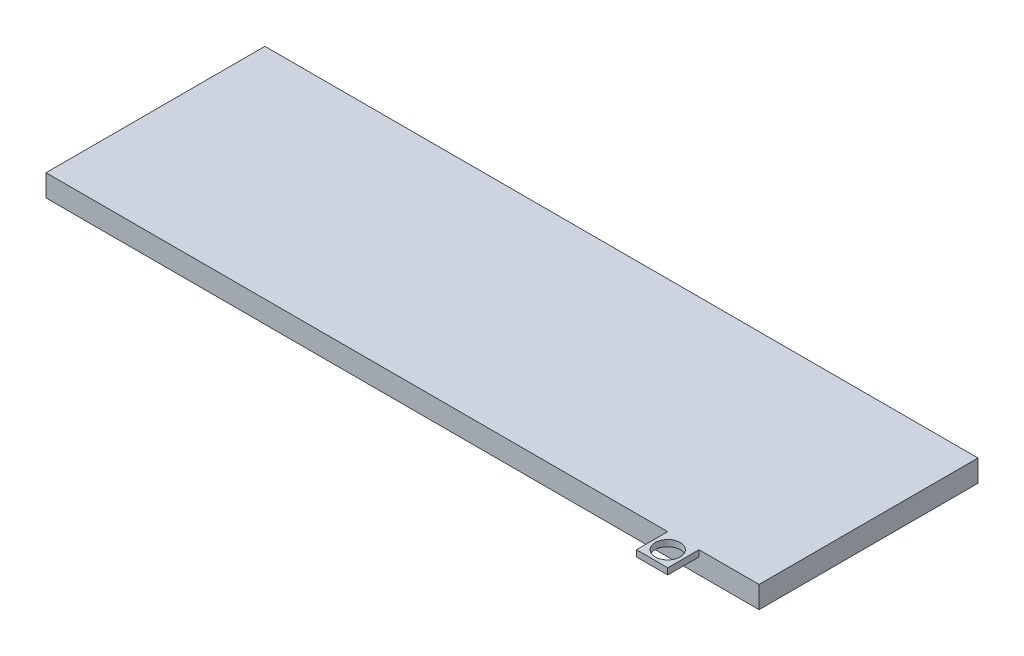
ISO-10303-21;
HEADER;
FILE_DESCRIPTION(('STEP AP214'),'2;1');
FILE_NAME('part.step','',(''),(''),'','','');
FILE_SCHEMA(('AUTOMOTIVE_DESIGN { 1 0 10303 214 1 1 1 1 }'));
ENDSEC;
DATA;
#1=APPLICATION_CONTEXT('core data for automotive mechanical design processes');
#2=APPLICATION_PROTOCOL_DEFINITION('international standard','automotive_design',2000,#1);
#3=PRODUCT_CONTEXT('',#1,'mechanical');
#4=PRODUCT('Part','Part','',(#3));
#5=PRODUCT_RELATED_PRODUCT_CATEGORY('part','',(#4));
#6=PRODUCT_DEFINITION_FORMATION('','',#4);
#7=PRODUCT_DEFINITION_CONTEXT('part definition',#1,'design');
#8=PRODUCT_DEFINITION('design','',#6,#7);
#9=PRODUCT_DEFINITION_SHAPE('','',#8);
#10=(LENGTH_UNIT() NAMED_UNIT(*) SI_UNIT(.MILLI.,.METRE.));
#11=(NAMED_UNIT(*) PLANE_ANGLE_UNIT() SI_UNIT($,.RADIAN.));
#12=(NAMED_UNIT(*) SI_UNIT($,.STERADIAN.) SOLID_ANGLE_UNIT());
#13=UNCERTAINTY_MEASURE_WITH_UNIT(LENGTH_MEASURE(1.E-05),#10,'distance_accuracy_value','');
#14=(GEOMETRIC_REPRESENTATION_CONTEXT(3) GLOBAL_UNCERTAINTY_ASSIGNED_CONTEXT((#13)) GLOBAL_UNIT_ASSIGNED_CONTEXT((#10,
#11,#12)) REPRESENTATION_CONTEXT('',''));
#15=CARTESIAN_POINT('',(0.,0.,0.));
#16=DIRECTION('',(0.,0.,1.));
#17=DIRECTION('',(1.,0.,0.));
#18=AXIS2_PLACEMENT_3D('',#15,#16,#17);
#19=CARTESIAN_POINT('',(110.927364864865,1.1264705882353,70.));
#20=DIRECTION('',(0.,1.,0.));
#21=DIRECTION('',(0.,0.,1.));
#22=AXIS2_PLACEMENT_3D('',#19,#20,#21);
#23=PLANE('',#22);
#24=CARTESIAN_POINT('',(88.7182207620565,1.1264705882353,75.));
#25=DIRECTION('',(0.,-1.,0.));
#26=DIRECTION('',(0.,0.,-1.));
#27=AXIS2_PLACEMENT_3D('',#24,#25,#26);
#28=CIRCLE('',#27,4.00000000000001);
#29=CARTESIAN_POINT('',(88.7182207620565,1.1264705882353,71.));
#30=VERTEX_POINT('',#29);
#31=EDGE_CURVE('E249',#30,#30,#28,.T.);
#32=ORIENTED_EDGE('',*,*,#31,.F.);
#33=EDGE_LOOP('',(#32));
#34=FACE_BOUND('',#33,.T.);
#35=DIRECTION('',(-1.,0.,0.));
#36=VECTOR('',#35,1.);
#37=CARTESIAN_POINT('',(-113.072635135135,1.1264705882353,70.));
#38=LINE('',#37,#36);
#39=CARTESIAN_POINT('',(93.7182207620565,1.1264705882353,70.));
#40=VERTEX_POINT('',#39);
#41=CARTESIAN_POINT('',(83.7182207620565,1.1264705882353,70.));
#42=VERTEX_POINT('',#41);
#43=EDGE_CURVE('E143',#40,#42,#38,.T.);
#44=ORIENTED_EDGE('',*,*,#43,.F.);
#45=DIRECTION('',(0.,0.,1.));
#46=VECTOR('',#45,1.);
#47=CARTESIAN_POINT('',(93.7182207620565,1.1264705882353,70.));
#48=LINE('',#47,#46);
#49=CARTESIAN_POINT('',(93.7182207620565,1.1264705882353,80.));
#50=VERTEX_POINT('',#49);
#51=EDGE_CURVE('E231',#40,#50,#48,.T.);
#52=ORIENTED_EDGE('',*,*,#51,.T.);
#53=DIRECTION('',(-1.,0.,0.));
#54=VECTOR('',#53,1.);
#55=CARTESIAN_POINT('',(83.7182207620565,1.1264705882353,80.));
#56=LINE('',#55,#54);
#57=CARTESIAN_POINT('',(83.7182207620565,1.1264705882353,80.));
#58=VERTEX_POINT('',#57);
#59=EDGE_CURVE('E226',#50,#58,#56,.T.);
#60=ORIENTED_EDGE('',*,*,#59,.T.);
#61=DIRECTION('',(0.,0.,-1.));
#62=VECTOR('',#61,1.);
#63=CARTESIAN_POINT('',(83.7182207620565,1.1264705882353,70.));
#64=LINE('',#63,#62);
#65=EDGE_CURVE('E235',#58,#42,#64,.T.);
#66=ORIENTED_EDGE('',*,*,#65,.T.);
#67=EDGE_LOOP('',(#44,#52,#60,#66));
#68=FACE_BOUND('',#67,.T.);
#69=ADVANCED_FACE('F40',(#34,#68),#23,.F.);
#70=CARTESIAN_POINT('',(-113.072635135135,1.1264705882353,70.));
#71=DIRECTION('',(-1.,0.,0.));
#72=DIRECTION('',(0.,0.,1.));
#73=AXIS2_PLACEMENT_3D('',#70,#71,#72);
#74=PLANE('',#73);
#75=DIRECTION('',(0.,0.,-1.));
#76=VECTOR('',#75,1.);
#77=CARTESIAN_POINT('',(-113.072635135135,1.1264705882353,70.));
#78=LINE('',#77,#76);
#79=CARTESIAN_POINT('',(-113.072635135135,1.1264705882353,68.));
#80=VERTEX_POINT('',#79);
#81=CARTESIAN_POINT('',(-113.072635135135,1.1264705882353,2.));
#82=VERTEX_POINT('',#81);
#83=EDGE_CURVE('E64',#80,#82,#78,.T.);
#84=ORIENTED_EDGE('',*,*,#83,.F.);
#85=DIRECTION('',(0.,-1.,0.));
#86=VECTOR('',#85,1.);
#87=CARTESIAN_POINT('',(-113.072635135135,-3.8735294117647,68.));
#88=LINE('',#87,#86);
#89=CARTESIAN_POINT('',(-113.072635135135,-3.8735294117647,68.));
#90=VERTEX_POINT('',#89);
#91=EDGE_CURVE('E134',#80,#90,#88,.T.);
#92=ORIENTED_EDGE('',*,*,#91,.T.);
#93=DIRECTION('',(0.,0.,-1.));
#94=VECTOR('',#93,1.);
#95=CARTESIAN_POINT('',(-113.072635135135,-3.8735294117647,70.));
#96=LINE('',#95,#94);
#97=CARTESIAN_POINT('',(-113.072635135135,-3.8735294117647,2.));
#98=VERTEX_POINT('',#97);
#99=EDGE_CURVE('E56',#90,#98,#96,.T.);
#100=ORIENTED_EDGE('',*,*,#99,.T.);
#101=DIRECTION('',(0.,1.,0.));
#102=VECTOR('',#101,1.);
#103=CARTESIAN_POINT('',(-113.072635135135,-3.8735294117647,2.));
#104=LINE('',#103,#102);
#105=EDGE_CURVE('E206',#98,#82,#104,.T.);
#106=ORIENTED_EDGE('',*,*,#105,.T.);
#107=EDGE_LOOP('',(#84,#92,#100,#106));
#108=FACE_BOUND('',#107,.T.);
#109=ADVANCED_FACE('F141',(#108),#74,.F.);
#110=DIRECTION('',(0.,0.,-1.));
#111=VECTOR('',#110,1.);
#112=CARTESIAN_POINT('',(110.927364864865,1.1264705882353,70.));
#113=LINE('',#112,#111);
#114=CARTESIAN_POINT('',(110.927364864865,1.1264705882353,68.));
#115=VERTEX_POINT('',#114);
#116=CARTESIAN_POINT('',(110.927364864865,1.1264705882353,2.));
#117=VERTEX_POINT('',#116);
#118=EDGE_CURVE('E155',#115,#117,#113,.T.);
#119=ORIENTED_EDGE('',*,*,#118,.F.);
#120=DIRECTION('',(-1.,0.,0.));
#121=VECTOR('',#120,1.);
#122=CARTESIAN_POINT('',(-113.072635135135,1.1264705882353,68.));
#123=LINE('',#122,#121);
#124=EDGE_CURVE('E253',#115,#80,#123,.T.);
#125=ORIENTED_EDGE('',*,*,#124,.T.);
#126=ORIENTED_EDGE('',*,*,#83,.T.);
#127=DIRECTION('',(1.,0.,0.));
#128=VECTOR('',#127,1.);
#129=CARTESIAN_POINT('',(-113.072635135135,1.1264705882353,2.));
#130=LINE('',#129,#128);
#131=EDGE_CURVE('E203',#82,#117,#130,.T.);
#132=ORIENTED_EDGE('',*,*,#131,.T.);
#133=EDGE_LOOP('',(#119,#125,#126,#132));
#134=FACE_BOUND('',#133,.T.);
#135=ADVANCED_FACE('F265',(#134),#23,.F.);
#136=CARTESIAN_POINT('',(110.927364864865,1.1264705882353,70.));
#137=DIRECTION('',(1.,0.,0.));
#138=DIRECTION('',(0.,0.,-1.));
#139=AXIS2_PLACEMENT_3D('',#136,#137,#138);
#140=PLANE('',#139);
#141=DIRECTION('',(0.,0.,-1.));
#142=VECTOR('',#141,1.);
#143=CARTESIAN_POINT('',(110.927364864865,-3.87352941176471,70.));
#144=LINE('',#143,#142);
#145=CARTESIAN_POINT('',(110.927364864865,-3.87352941176471,68.));
#146=VERTEX_POINT('',#145);
#147=CARTESIAN_POINT('',(110.927364864865,-3.87352941176471,2.));
#148=VERTEX_POINT('',#147);
#149=EDGE_CURVE('E160',#146,#148,#144,.T.);
#150=ORIENTED_EDGE('',*,*,#149,.F.);
#151=DIRECTION('',(0.,1.,0.));
#152=VECTOR('',#151,1.);
#153=CARTESIAN_POINT('',(110.927364864865,1.1264705882353,68.));
#154=LINE('',#153,#152);
#155=EDGE_CURVE('E136',#146,#115,#154,.T.);
#156=ORIENTED_EDGE('',*,*,#155,.T.);
#157=ORIENTED_EDGE('',*,*,#118,.T.);
#158=DIRECTION('',(0.,-1.,0.));
#159=VECTOR('',#158,1.);
#160=CARTESIAN_POINT('',(110.927364864865,1.1264705882353,2.));
#161=LINE('',#160,#159);
#162=EDGE_CURVE('E187',#117,#148,#161,.T.);
#163=ORIENTED_EDGE('',*,*,#162,.T.);
#164=EDGE_LOOP('',(#150,#156,#157,#163));
#165=FACE_BOUND('',#164,.T.);
#166=ADVANCED_FACE('F264',(#165),#140,.F.);
#167=CARTESIAN_POINT('',(112.927364864865,3.12647058823529,70.));
#168=DIRECTION('',(0.,-1.,0.));
#169=DIRECTION('',(1.,0.,0.));
#170=AXIS2_PLACEMENT_3D('',#167,#168,#169);
#171=PLANE('',#170);
#172=DIRECTION('',(-1.,0.,0.));
#173=VECTOR('',#172,1.);
#174=CARTESIAN_POINT('',(112.927364864865,3.12647058823529,0.));
#175=LINE('',#174,#173);
#176=CARTESIAN_POINT('',(112.927364864865,3.12647058823529,0.));
#177=VERTEX_POINT('',#176);
#178=CARTESIAN_POINT('',(-115.072635135135,3.1264705882353,0.));
#179=VERTEX_POINT('',#178);
#180=EDGE_CURVE('E183',#177,#179,#175,.T.);
#181=ORIENTED_EDGE('',*,*,#180,.T.);
#182=DIRECTION('',(0.,0.,-1.));
#183=VECTOR('',#182,1.);
#184=CARTESIAN_POINT('',(-115.072635135135,3.1264705882353,70.));
#185=LINE('',#184,#183);
#186=CARTESIAN_POINT('',(-115.072635135135,3.1264705882353,70.));
#187=VERTEX_POINT('',#186);
#188=EDGE_CURVE('E11',#187,#179,#185,.T.);
#189=ORIENTED_EDGE('',*,*,#188,.F.);
#190=DIRECTION('',(-1.,0.,0.));
#191=VECTOR('',#190,1.);
#192=CARTESIAN_POINT('',(112.927364864865,3.12647058823529,70.));
#193=LINE('',#192,#191);
#194=CARTESIAN_POINT('',(83.7182207620565,3.1264705882353,70.));
#195=VERTEX_POINT('',#194);
#196=EDGE_CURVE('E175',#195,#187,#193,.T.);
#197=ORIENTED_EDGE('',*,*,#196,.F.);
#198=DIRECTION('',(0.,0.,-1.));
#199=VECTOR('',#198,1.);
#200=CARTESIAN_POINT('',(83.7182207620565,3.1264705882353,70.));
#201=LINE('',#200,#199);
#202=CARTESIAN_POINT('',(83.7182207620565,3.1264705882353,80.));
#203=VERTEX_POINT('',#202);
#204=EDGE_CURVE('E230',#203,#195,#201,.T.);
#205=ORIENTED_EDGE('',*,*,#204,.F.);
#206=DIRECTION('',(-1.,0.,0.));
#207=VECTOR('',#206,1.);
#208=CARTESIAN_POINT('',(83.7182207620565,3.1264705882353,80.));
#209=LINE('',#208,#207);
#210=CARTESIAN_POINT('',(93.7182207620565,3.1264705882353,80.));
#211=VERTEX_POINT('',#210);
#212=EDGE_CURVE('E217',#211,#203,#209,.T.);
#213=ORIENTED_EDGE('',*,*,#212,.F.);
#214=DIRECTION('',(0.,0.,1.));
#215=VECTOR('',#214,1.);
#216=CARTESIAN_POINT('',(93.7182207620565,3.1264705882353,70.));
#217=LINE('',#216,#215);
#218=CARTESIAN_POINT('',(93.7182207620565,3.1264705882353,70.));
#219=VERTEX_POINT('',#218);
#220=EDGE_CURVE('E243',#219,#211,#217,.T.);
#221=ORIENTED_EDGE('',*,*,#220,.F.);
#222=CARTESIAN_POINT('',(112.927364864865,3.12647058823529,70.));
#223=VERTEX_POINT('',#222);
#224=EDGE_CURVE('E196',#223,#219,#193,.T.);
#225=ORIENTED_EDGE('',*,*,#224,.F.);
#226=DIRECTION('',(0.,0.,-1.));
#227=VECTOR('',#226,1.);
#228=CARTESIAN_POINT('',(112.927364864865,3.12647058823529,70.));
#229=LINE('',#228,#227);
#230=EDGE_CURVE('E167',#223,#177,#229,.T.);
#231=ORIENTED_EDGE('',*,*,#230,.T.);
#232=EDGE_LOOP('',(#181,#189,#197,#205,#213,#221,#225,#231));
#233=FACE_BOUND('',#232,.T.);
#234=CARTESIAN_POINT('',(88.7182207620565,3.1264705882353,75.));
#235=DIRECTION('',(0.,-1.,0.));
#236=DIRECTION('',(0.,0.,-1.));
#237=AXIS2_PLACEMENT_3D('',#234,#235,#236);
#238=CIRCLE('',#237,4.00000000000001);
#239=CARTESIAN_POINT('',(88.7182207620565,3.1264705882353,71.));
#240=VERTEX_POINT('',#239);
#241=EDGE_CURVE('E239',#240,#240,#238,.T.);
#242=ORIENTED_EDGE('',*,*,#241,.T.);
#243=EDGE_LOOP('',(#242));
#244=FACE_BOUND('',#243,.T.);
#245=ADVANCED_FACE('F42',(#233,#244),#171,.F.);
#246=CARTESIAN_POINT('',(-115.072635135135,3.1264705882353,70.));
#247=DIRECTION('',(1.,0.,0.));
#248=DIRECTION('',(0.,0.,-1.));
#249=AXIS2_PLACEMENT_3D('',#246,#247,#248);
#250=PLANE('',#249);
#251=DIRECTION('',(0.,-1.,0.));
#252=VECTOR('',#251,1.);
#253=CARTESIAN_POINT('',(-115.072635135135,3.1264705882353,0.));
#254=LINE('',#253,#252);
#255=CARTESIAN_POINT('',(-115.072635135135,-3.8735294117647,0.));
#256=VERTEX_POINT('',#255);
#257=EDGE_CURVE('E179',#179,#256,#254,.T.);
#258=ORIENTED_EDGE('',*,*,#257,.T.);
#259=DIRECTION('',(0.,0.,-1.));
#260=VECTOR('',#259,1.);
#261=CARTESIAN_POINT('',(-115.072635135135,-3.8735294117647,70.));
#262=LINE('',#261,#260);
#263=CARTESIAN_POINT('',(-115.072635135135,-3.8735294117647,70.));
#264=VERTEX_POINT('',#263);
#265=EDGE_CURVE('E49',#264,#256,#262,.T.);
#266=ORIENTED_EDGE('',*,*,#265,.F.);
#267=DIRECTION('',(0.,-1.,0.));
#268=VECTOR('',#267,1.);
#269=CARTESIAN_POINT('',(-115.072635135135,3.1264705882353,70.));
#270=LINE('',#269,#268);
#271=EDGE_CURVE('E193',#187,#264,#270,.T.);
#272=ORIENTED_EDGE('',*,*,#271,.F.);
#273=ORIENTED_EDGE('',*,*,#188,.T.);
#274=EDGE_LOOP('',(#258,#266,#272,#273));
#275=FACE_BOUND('',#274,.T.);
#276=ADVANCED_FACE('F302',(#275),#250,.F.);
#277=CARTESIAN_POINT('',(110.927364864865,-3.87352941176471,70.));
#278=DIRECTION('',(0.,1.,0.));
#279=DIRECTION('',(0.,0.,1.));
#280=AXIS2_PLACEMENT_3D('',#277,#278,#279);
#281=PLANE('',#280);
#282=ORIENTED_EDGE('',*,*,#99,.F.);
#283=DIRECTION('',(1.,0.,0.));
#284=VECTOR('',#283,1.);
#285=CARTESIAN_POINT('',(-113.072635135135,-3.8735294117647,68.));
#286=LINE('',#285,#284);
#287=EDGE_CURVE('E132',#90,#146,#286,.T.);
#288=ORIENTED_EDGE('',*,*,#287,.T.);
#289=ORIENTED_EDGE('',*,*,#149,.T.);
#290=DIRECTION('',(-1.,0.,0.));
#291=VECTOR('',#290,1.);
#292=CARTESIAN_POINT('',(110.927364864865,-3.87352941176471,2.));
#293=LINE('',#292,#291);
#294=EDGE_CURVE('E149',#148,#98,#293,.T.);
#295=ORIENTED_EDGE('',*,*,#294,.T.);
#296=EDGE_LOOP('',(#282,#288,#289,#295));
#297=FACE_BOUND('',#296,.T.);
#298=DIRECTION('',(1.,0.,0.));
#299=VECTOR('',#298,1.);
#300=CARTESIAN_POINT('',(110.927364864865,-3.87352941176471,0.));
#301=LINE('',#300,#299);
#302=CARTESIAN_POINT('',(112.927364864865,-3.87352941176471,0.));
#303=VERTEX_POINT('',#302);
#304=EDGE_CURVE('E176',#256,#303,#301,.T.);
#305=ORIENTED_EDGE('',*,*,#304,.T.);
#306=DIRECTION('',(0.,0.,-1.));
#307=VECTOR('',#306,1.);
#308=CARTESIAN_POINT('',(112.927364864865,-3.87352941176471,70.));
#309=LINE('',#308,#307);
#310=CARTESIAN_POINT('',(112.927364864865,-3.87352941176471,70.));
#311=VERTEX_POINT('',#310);
#312=EDGE_CURVE('E163',#311,#303,#309,.T.);
#313=ORIENTED_EDGE('',*,*,#312,.F.);
#314=DIRECTION('',(1.,0.,0.));
#315=VECTOR('',#314,1.);
#316=CARTESIAN_POINT('',(-115.072635135135,-3.8735294117647,70.));
#317=LINE('',#316,#315);
#318=EDGE_CURVE('E190',#264,#311,#317,.T.);
#319=ORIENTED_EDGE('',*,*,#318,.F.);
#320=ORIENTED_EDGE('',*,*,#265,.T.);
#321=EDGE_LOOP('',(#305,#313,#319,#320));
#322=FACE_BOUND('',#321,.T.);
#323=ADVANCED_FACE('F146',(#297,#322),#281,.F.);
#324=CARTESIAN_POINT('',(112.927364864865,3.12647058823529,70.));
#325=DIRECTION('',(-1.,0.,0.));
#326=DIRECTION('',(0.,0.,1.));
#327=AXIS2_PLACEMENT_3D('',#324,#325,#326);
#328=PLANE('',#327);
#329=DIRECTION('',(0.,1.,0.));
#330=VECTOR('',#329,1.);
#331=CARTESIAN_POINT('',(112.927364864865,3.12647058823529,0.));
#332=LINE('',#331,#330);
#333=EDGE_CURVE('E172',#303,#177,#332,.T.);
#334=ORIENTED_EDGE('',*,*,#333,.T.);
#335=ORIENTED_EDGE('',*,*,#230,.F.);
#336=DIRECTION('',(0.,1.,0.));
#337=VECTOR('',#336,1.);
#338=CARTESIAN_POINT('',(112.927364864865,3.12647058823529,70.));
#339=LINE('',#338,#337);
#340=EDGE_CURVE('E171',#311,#223,#339,.T.);
#341=ORIENTED_EDGE('',*,*,#340,.F.);
#342=ORIENTED_EDGE('',*,*,#312,.T.);
#343=EDGE_LOOP('',(#334,#335,#341,#342));
#344=FACE_BOUND('',#343,.T.);
#345=ADVANCED_FACE('F307',(#344),#328,.F.);
#346=CARTESIAN_POINT('',(0.,0.,70.));
#347=DIRECTION('',(0.,0.,1.));
#348=DIRECTION('',(1.,0.,0.));
#349=AXIS2_PLACEMENT_3D('',#346,#347,#348);
#350=PLANE('',#349);
#351=DIRECTION('',(0.,-1.,0.));
#352=VECTOR('',#351,1.);
#353=CARTESIAN_POINT('',(83.7182207620565,3.1264705882353,70.));
#354=LINE('',#353,#352);
#355=EDGE_CURVE('E212',#195,#42,#354,.T.);
#356=ORIENTED_EDGE('',*,*,#355,.F.);
#357=ORIENTED_EDGE('',*,*,#196,.T.);
#358=ORIENTED_EDGE('',*,*,#271,.T.);
#359=ORIENTED_EDGE('',*,*,#318,.T.);
#360=ORIENTED_EDGE('',*,*,#340,.T.);
#361=ORIENTED_EDGE('',*,*,#224,.T.);
#362=DIRECTION('',(0.,-1.,0.));
#363=VECTOR('',#362,1.);
#364=CARTESIAN_POINT('',(93.7182207620565,3.1264705882353,70.));
#365=LINE('',#364,#363);
#366=EDGE_CURVE('E216',#219,#40,#365,.T.);
#367=ORIENTED_EDGE('',*,*,#366,.T.);
#368=ORIENTED_EDGE('',*,*,#43,.T.);
#369=EDGE_LOOP('',(#356,#357,#358,#359,#360,#361,#367,#368));
#370=FACE_BOUND('',#369,.T.);
#371=ADVANCED_FACE('F281',(#370),#350,.T.);
#372=CARTESIAN_POINT('',(0.,0.,0.));
#373=DIRECTION('',(0.,0.,1.));
#374=DIRECTION('',(1.,0.,0.));
#375=AXIS2_PLACEMENT_3D('',#372,#373,#374);
#376=PLANE('',#375);
#377=ORIENTED_EDGE('',*,*,#304,.F.);
#378=ORIENTED_EDGE('',*,*,#257,.F.);
#379=ORIENTED_EDGE('',*,*,#180,.F.);
#380=ORIENTED_EDGE('',*,*,#333,.F.);
#381=EDGE_LOOP('',(#377,#378,#379,#380));
#382=FACE_BOUND('',#381,.T.);
#383=ADVANCED_FACE('F272',(#382),#376,.F.);
#384=CARTESIAN_POINT('',(0.,0.,2.));
#385=DIRECTION('',(0.,0.,-1.));
#386=DIRECTION('',(-1.,0.,0.));
#387=AXIS2_PLACEMENT_3D('',#384,#385,#386);
#388=PLANE('',#387);
#389=ORIENTED_EDGE('',*,*,#294,.F.);
#390=ORIENTED_EDGE('',*,*,#162,.F.);
#391=ORIENTED_EDGE('',*,*,#131,.F.);
#392=ORIENTED_EDGE('',*,*,#105,.F.);
#393=EDGE_LOOP('',(#389,#390,#391,#392));
#394=FACE_BOUND('',#393,.T.);
#395=ADVANCED_FACE('F269',(#394),#388,.F.);
#396=CARTESIAN_POINT('',(83.7182207620565,3.1264705882353,70.));
#397=DIRECTION('',(-1.,0.,0.));
#398=DIRECTION('',(0.,0.,1.));
#399=AXIS2_PLACEMENT_3D('',#396,#397,#398);
#400=PLANE('',#399);
#401=ORIENTED_EDGE('',*,*,#65,.F.);
#402=DIRECTION('',(0.,-1.,0.));
#403=VECTOR('',#402,1.);
#404=CARTESIAN_POINT('',(83.7182207620565,3.1264705882353,80.));
#405=LINE('',#404,#403);
#406=EDGE_CURVE('E211',#203,#58,#405,.T.);
#407=ORIENTED_EDGE('',*,*,#406,.F.);
#408=ORIENTED_EDGE('',*,*,#204,.T.);
#409=ORIENTED_EDGE('',*,*,#355,.T.);
#410=EDGE_LOOP('',(#401,#407,#408,#409));
#411=FACE_BOUND('',#410,.T.);
#412=ADVANCED_FACE('F271',(#411),#400,.T.);
#413=CARTESIAN_POINT('',(83.7182207620565,3.1264705882353,80.));
#414=DIRECTION('',(0.,0.,1.));
#415=DIRECTION('',(1.,0.,0.));
#416=AXIS2_PLACEMENT_3D('',#413,#414,#415);
#417=PLANE('',#416);
#418=ORIENTED_EDGE('',*,*,#59,.F.);
#419=DIRECTION('',(0.,-1.,0.));
#420=VECTOR('',#419,1.);
#421=CARTESIAN_POINT('',(93.7182207620565,3.1264705882353,80.));
#422=LINE('',#421,#420);
#423=EDGE_CURVE('E221',#211,#50,#422,.T.);
#424=ORIENTED_EDGE('',*,*,#423,.F.);
#425=ORIENTED_EDGE('',*,*,#212,.T.);
#426=ORIENTED_EDGE('',*,*,#406,.T.);
#427=EDGE_LOOP('',(#418,#424,#425,#426));
#428=FACE_BOUND('',#427,.T.);
#429=ADVANCED_FACE('F278',(#428),#417,.T.);
#430=CARTESIAN_POINT('',(93.7182207620565,3.1264705882353,70.));
#431=DIRECTION('',(1.,0.,0.));
#432=DIRECTION('',(0.,0.,-1.));
#433=AXIS2_PLACEMENT_3D('',#430,#431,#432);
#434=PLANE('',#433);
#435=ORIENTED_EDGE('',*,*,#51,.F.);
#436=ORIENTED_EDGE('',*,*,#366,.F.);
#437=ORIENTED_EDGE('',*,*,#220,.T.);
#438=ORIENTED_EDGE('',*,*,#423,.T.);
#439=EDGE_LOOP('',(#435,#436,#437,#438));
#440=FACE_BOUND('',#439,.T.);
#441=ADVANCED_FACE('F335',(#440),#434,.T.);
#442=CARTESIAN_POINT('',(88.7182207620565,3.1264705882353,75.));
#443=DIRECTION('',(0.,-1.,0.));
#444=DIRECTION('',(0.,0.,-1.));
#445=AXIS2_PLACEMENT_3D('',#442,#443,#444);
#446=CYLINDRICAL_SURFACE('',#445,4.00000000000001);
#447=ORIENTED_EDGE('',*,*,#241,.F.);
#448=EDGE_LOOP('',(#447));
#449=FACE_BOUND('',#448,.T.);
#450=ORIENTED_EDGE('',*,*,#31,.T.);
#451=EDGE_LOOP('',(#450));
#452=FACE_BOUND('',#451,.T.);
#453=ADVANCED_FACE('F343',(#449,#452),#446,.F.);
#454=CARTESIAN_POINT('',(0.,0.,68.));
#455=DIRECTION('',(0.,0.,-1.));
#456=DIRECTION('',(-1.,0.,0.));
#457=AXIS2_PLACEMENT_3D('',#454,#455,#456);
#458=PLANE('',#457);
#459=ORIENTED_EDGE('',*,*,#91,.F.);
#460=ORIENTED_EDGE('',*,*,#124,.F.);
#461=ORIENTED_EDGE('',*,*,#155,.F.);
#462=ORIENTED_EDGE('',*,*,#287,.F.);
#463=EDGE_LOOP('',(#459,#460,#461,#462));
#464=FACE_BOUND('',#463,.T.);
#465=ADVANCED_FACE('F133',(#464),#458,.T.);
#466=CLOSED_SHELL('',(#69,#109,#135,#166,#245,#276,#323,#345,#371,#383,#395,#412,#429,#441,#453,#465));
#467=MANIFOLD_SOLID_BREP('B2',#466);
#468=ADVANCED_BREP_SHAPE_REPRESENTATION('',(#18,#467),#14);
#469=SHAPE_DEFINITION_REPRESENTATION(#9,#468);
ENDSEC;
END-ISO-10303-21;
